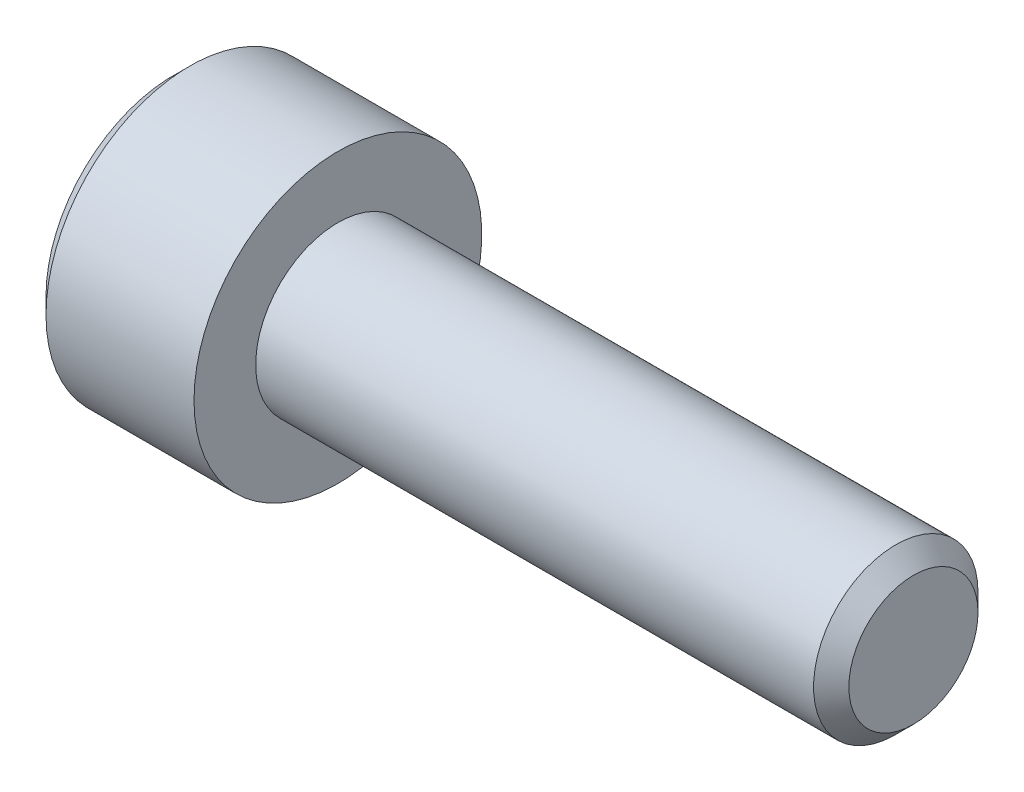
ISO-10303-21;
HEADER;
FILE_DESCRIPTION(('STEP AP214'),'2;1');
FILE_NAME('part.step','',(''),(''),'','','');
FILE_SCHEMA(('AUTOMOTIVE_DESIGN { 1 0 10303 214 1 1 1 1 }'));
ENDSEC;
DATA;
#1=APPLICATION_CONTEXT('core data for automotive mechanical design processes');
#2=APPLICATION_PROTOCOL_DEFINITION('international standard','automotive_design',2000,#1);
#3=PRODUCT_CONTEXT('',#1,'mechanical');
#4=PRODUCT('Part','Part','',(#3));
#5=PRODUCT_RELATED_PRODUCT_CATEGORY('part','',(#4));
#6=PRODUCT_DEFINITION_FORMATION('','',#4);
#7=PRODUCT_DEFINITION_CONTEXT('part definition',#1,'design');
#8=PRODUCT_DEFINITION('design','',#6,#7);
#9=PRODUCT_DEFINITION_SHAPE('','',#8);
#10=(LENGTH_UNIT() NAMED_UNIT(*) SI_UNIT(.MILLI.,.METRE.));
#11=(NAMED_UNIT(*) PLANE_ANGLE_UNIT() SI_UNIT($,.RADIAN.));
#12=(NAMED_UNIT(*) SI_UNIT($,.STERADIAN.) SOLID_ANGLE_UNIT());
#13=UNCERTAINTY_MEASURE_WITH_UNIT(LENGTH_MEASURE(1.E-05),#10,'distance_accuracy_value','');
#14=(GEOMETRIC_REPRESENTATION_CONTEXT(3) GLOBAL_UNCERTAINTY_ASSIGNED_CONTEXT((#13)) GLOBAL_UNIT_ASSIGNED_CONTEXT((#10,
#11,#12)) REPRESENTATION_CONTEXT('',''));
#15=CARTESIAN_POINT('',(0.,0.,0.));
#16=DIRECTION('',(0.,0.,1.));
#17=DIRECTION('',(1.,0.,0.));
#18=AXIS2_PLACEMENT_3D('',#15,#16,#17);
#19=CARTESIAN_POINT('',(-4.,-3.1,3.1));
#20=DIRECTION('',(-1.,0.,0.));
#21=DIRECTION('',(0.,1.,0.));
#22=AXIS2_PLACEMENT_3D('',#19,#20,#21);
#23=PLANE('',#22);
#24=CARTESIAN_POINT('',(-4.,0.,0.));
#25=DIRECTION('',(-1.,0.,0.));
#26=DIRECTION('',(0.,0.,-1.));
#27=AXIS2_PLACEMENT_3D('',#24,#25,#26);
#28=CIRCLE('',#27,3.1);
#29=CARTESIAN_POINT('',(-4.,0.,-3.1));
#30=VERTEX_POINT('',#29);
#31=EDGE_CURVE('E116',#30,#30,#28,.F.);
#32=ORIENTED_EDGE('',*,*,#31,.F.);
#33=EDGE_LOOP('',(#32));
#34=FACE_BOUND('',#33,.T.);
#35=DIRECTION('',(0.,0.500000000000009,-0.866025403784433));
#36=VECTOR('',#35,1.);
#37=CARTESIAN_POINT('',(-4.,-1.7320508075689,0.));
#38=LINE('',#37,#36);
#39=CARTESIAN_POINT('',(-4.,-1.7320508075689,0.));
#40=VERTEX_POINT('',#39);
#41=CARTESIAN_POINT('',(-4.,-0.86602540378444,-1.5));
#42=VERTEX_POINT('',#41);
#43=EDGE_CURVE('E101',#40,#42,#38,.T.);
#44=ORIENTED_EDGE('',*,*,#43,.T.);
#45=DIRECTION('',(0.,1.,0.));
#46=VECTOR('',#45,1.);
#47=CARTESIAN_POINT('',(-4.,-0.86602540378444,-1.5));
#48=LINE('',#47,#46);
#49=CARTESIAN_POINT('',(-4.,0.866025403784441,-1.5));
#50=VERTEX_POINT('',#49);
#51=EDGE_CURVE('E89',#42,#50,#48,.T.);
#52=ORIENTED_EDGE('',*,*,#51,.T.);
#53=DIRECTION('',(0.,0.500000000000009,0.866025403784433));
#54=VECTOR('',#53,1.);
#55=CARTESIAN_POINT('',(-4.,0.866025403784441,-1.5));
#56=LINE('',#55,#54);
#57=CARTESIAN_POINT('',(-4.,1.7320508075689,0.));
#58=VERTEX_POINT('',#57);
#59=EDGE_CURVE('E100',#50,#58,#56,.T.);
#60=ORIENTED_EDGE('',*,*,#59,.T.);
#61=DIRECTION('',(0.,-0.500000000000009,0.866025403784433));
#62=VECTOR('',#61,1.);
#63=CARTESIAN_POINT('',(-4.,1.7320508075689,0.));
#64=LINE('',#63,#62);
#65=CARTESIAN_POINT('',(-4.,0.866025403784441,1.5));
#66=VERTEX_POINT('',#65);
#67=EDGE_CURVE('E126',#58,#66,#64,.T.);
#68=ORIENTED_EDGE('',*,*,#67,.T.);
#69=DIRECTION('',(0.,-1.,0.));
#70=VECTOR('',#69,1.);
#71=CARTESIAN_POINT('',(-4.,0.866025403784441,1.5));
#72=LINE('',#71,#70);
#73=CARTESIAN_POINT('',(-4.,-0.86602540378444,1.5));
#74=VERTEX_POINT('',#73);
#75=EDGE_CURVE('E131',#66,#74,#72,.T.);
#76=ORIENTED_EDGE('',*,*,#75,.T.);
#77=DIRECTION('',(0.,-0.500000000000009,-0.866025403784433));
#78=VECTOR('',#77,1.);
#79=CARTESIAN_POINT('',(-4.,-0.86602540378444,1.5));
#80=LINE('',#79,#78);
#81=EDGE_CURVE('E115',#74,#40,#80,.T.);
#82=ORIENTED_EDGE('',*,*,#81,.T.);
#83=EDGE_LOOP('',(#44,#52,#60,#68,#76,#82));
#84=FACE_BOUND('',#83,.T.);
#85=ADVANCED_FACE('F17',(#34,#84),#23,.T.);
#86=CARTESIAN_POINT('',(0.,-3.5,-3.5));
#87=DIRECTION('',(1.,0.,0.));
#88=DIRECTION('',(0.,1.,0.));
#89=AXIS2_PLACEMENT_3D('',#86,#87,#88);
#90=PLANE('',#89);
#91=CARTESIAN_POINT('',(0.,0.,0.));
#92=DIRECTION('',(1.,0.,0.));
#93=DIRECTION('',(0.,0.,1.));
#94=AXIS2_PLACEMENT_3D('',#91,#92,#93);
#95=CIRCLE('',#94,3.5);
#96=CARTESIAN_POINT('',(0.,0.,3.5));
#97=VERTEX_POINT('',#96);
#98=EDGE_CURVE('E138',#97,#97,#95,.T.);
#99=ORIENTED_EDGE('',*,*,#98,.T.);
#100=EDGE_LOOP('',(#99));
#101=FACE_BOUND('',#100,.T.);
#102=CARTESIAN_POINT('',(0.,0.,0.));
#103=DIRECTION('',(-1.,0.,0.));
#104=DIRECTION('',(0.,0.,-1.));
#105=AXIS2_PLACEMENT_3D('',#102,#103,#104);
#106=CIRCLE('',#105,2.);
#107=CARTESIAN_POINT('',(0.,0.,-2.));
#108=VERTEX_POINT('',#107);
#109=EDGE_CURVE('E143',#108,#108,#106,.F.);
#110=ORIENTED_EDGE('',*,*,#109,.F.);
#111=EDGE_LOOP('',(#110));
#112=FACE_BOUND('',#111,.T.);
#113=ADVANCED_FACE('F265',(#101,#112),#90,.T.);
#114=CARTESIAN_POINT('',(14.,-1.5705,-1.5705));
#115=DIRECTION('',(1.,0.,0.));
#116=DIRECTION('',(0.,1.,0.));
#117=AXIS2_PLACEMENT_3D('',#114,#115,#116);
#118=PLANE('',#117);
#119=CARTESIAN_POINT('',(14.,0.,0.));
#120=DIRECTION('',(1.,0.,0.));
#121=DIRECTION('',(0.,0.,1.));
#122=AXIS2_PLACEMENT_3D('',#119,#120,#121);
#123=CIRCLE('',#122,1.5705);
#124=CARTESIAN_POINT('',(14.,0.,1.5705));
#125=VERTEX_POINT('',#124);
#126=EDGE_CURVE('E146',#125,#125,#123,.T.);
#127=ORIENTED_EDGE('',*,*,#126,.T.);
#128=EDGE_LOOP('',(#127));
#129=FACE_BOUND('',#128,.T.);
#130=ADVANCED_FACE('F271',(#129),#118,.T.);
#131=CARTESIAN_POINT('',(-2.,-0.86602540378444,1.5));
#132=DIRECTION('',(0.,0.,-1.));
#133=DIRECTION('',(-1.,0.,0.));
#134=AXIS2_PLACEMENT_3D('',#131,#132,#133);
#135=PLANE('',#134);
#136=ORIENTED_EDGE('',*,*,#75,.F.);
#137=DIRECTION('',(1.,0.,0.));
#138=VECTOR('',#137,1.);
#139=CARTESIAN_POINT('',(-4.,0.86602540378444,1.5));
#140=LINE('',#139,#138);
#141=CARTESIAN_POINT('',(-2.,0.86602540378444,1.5));
#142=VERTEX_POINT('',#141);
#143=EDGE_CURVE('E149',#142,#66,#140,.F.);
#144=ORIENTED_EDGE('',*,*,#143,.F.);
#145=DIRECTION('',(0.,-1.,0.));
#146=VECTOR('',#145,1.);
#147=CARTESIAN_POINT('',(-2.,0.86602540378444,1.5));
#148=LINE('',#147,#146);
#149=CARTESIAN_POINT('',(-2.,0.,1.5));
#150=VERTEX_POINT('',#149);
#151=EDGE_CURVE('E151',#142,#150,#148,.T.);
#152=ORIENTED_EDGE('',*,*,#151,.T.);
#153=DIRECTION('',(0.,-1.,0.));
#154=VECTOR('',#153,1.);
#155=CARTESIAN_POINT('',(-2.,0.,1.5));
#156=LINE('',#155,#154);
#157=CARTESIAN_POINT('',(-2.,-0.86602540378444,1.5));
#158=VERTEX_POINT('',#157);
#159=EDGE_CURVE('E156',#150,#158,#156,.T.);
#160=ORIENTED_EDGE('',*,*,#159,.T.);
#161=DIRECTION('',(-1.,0.,0.));
#162=VECTOR('',#161,1.);
#163=CARTESIAN_POINT('',(-2.,-0.86602540378444,1.5));
#164=LINE('',#163,#162);
#165=EDGE_CURVE('E161',#158,#74,#164,.T.);
#166=ORIENTED_EDGE('',*,*,#165,.T.);
#167=EDGE_LOOP('',(#136,#144,#152,#160,#166));
#168=FACE_BOUND('',#167,.T.);
#169=ADVANCED_FACE('F277',(#168),#135,.T.);
#170=CARTESIAN_POINT('',(-4.,-1.7320508075689,0.));
#171=DIRECTION('',(0.,0.866025403784434,-0.500000000000009));
#172=DIRECTION('',(0.,0.500000000000009,0.866025403784434));
#173=AXIS2_PLACEMENT_3D('',#170,#171,#172);
#174=PLANE('',#173);
#175=ORIENTED_EDGE('',*,*,#81,.F.);
#176=ORIENTED_EDGE('',*,*,#165,.F.);
#177=DIRECTION('',(0.,-0.500000000000009,-0.866025403784434));
#178=VECTOR('',#177,1.);
#179=CARTESIAN_POINT('',(-2.,-0.86602540378444,1.5));
#180=LINE('',#179,#178);
#181=CARTESIAN_POINT('',(-2.,-1.29903810567666,0.750000000000018));
#182=VERTEX_POINT('',#181);
#183=EDGE_CURVE('E166',#158,#182,#180,.T.);
#184=ORIENTED_EDGE('',*,*,#183,.T.);
#185=DIRECTION('',(0.,-0.500000000000009,-0.866025403784434));
#186=VECTOR('',#185,1.);
#187=CARTESIAN_POINT('',(-2.,-1.29903810567666,0.750000000000018));
#188=LINE('',#187,#186);
#189=CARTESIAN_POINT('',(-2.,-1.7320508075689,0.));
#190=VERTEX_POINT('',#189);
#191=EDGE_CURVE('E171',#182,#190,#188,.T.);
#192=ORIENTED_EDGE('',*,*,#191,.T.);
#193=DIRECTION('',(-1.,0.,0.));
#194=VECTOR('',#193,1.);
#195=CARTESIAN_POINT('',(-2.,-1.7320508075689,0.));
#196=LINE('',#195,#194);
#197=EDGE_CURVE('E176',#190,#40,#196,.T.);
#198=ORIENTED_EDGE('',*,*,#197,.T.);
#199=EDGE_LOOP('',(#175,#176,#184,#192,#198));
#200=FACE_BOUND('',#199,.T.);
#201=ADVANCED_FACE('F281',(#200),#174,.T.);
#202=CARTESIAN_POINT('',(-4.,-0.866025403784441,-1.5));
#203=DIRECTION('',(0.,0.866025403784434,0.500000000000009));
#204=DIRECTION('',(0.,-0.500000000000009,0.866025403784434));
#205=AXIS2_PLACEMENT_3D('',#202,#203,#204);
#206=PLANE('',#205);
#207=ORIENTED_EDGE('',*,*,#43,.F.);
#208=ORIENTED_EDGE('',*,*,#197,.F.);
#209=DIRECTION('',(0.,0.500000000000009,-0.866025403784434));
#210=VECTOR('',#209,1.);
#211=CARTESIAN_POINT('',(-2.,-1.7320508075689,0.));
#212=LINE('',#211,#210);
#213=CARTESIAN_POINT('',(-2.,-1.29903810567666,-0.750000000000019));
#214=VERTEX_POINT('',#213);
#215=EDGE_CURVE('E180',#190,#214,#212,.T.);
#216=ORIENTED_EDGE('',*,*,#215,.T.);
#217=DIRECTION('',(0.,0.500000000000009,-0.866025403784433));
#218=VECTOR('',#217,1.);
#219=CARTESIAN_POINT('',(-2.,-1.29903810567666,-0.750000000000019));
#220=LINE('',#219,#218);
#221=CARTESIAN_POINT('',(-2.,-0.866025403784441,-1.5));
#222=VERTEX_POINT('',#221);
#223=EDGE_CURVE('E110',#214,#222,#220,.T.);
#224=ORIENTED_EDGE('',*,*,#223,.T.);
#225=DIRECTION('',(-1.,0.,0.));
#226=VECTOR('',#225,1.);
#227=CARTESIAN_POINT('',(-2.,-0.866025403784441,-1.5));
#228=LINE('',#227,#226);
#229=EDGE_CURVE('E93',#222,#42,#228,.T.);
#230=ORIENTED_EDGE('',*,*,#229,.T.);
#231=EDGE_LOOP('',(#207,#208,#216,#224,#230));
#232=FACE_BOUND('',#231,.T.);
#233=ADVANCED_FACE('F105',(#232),#206,.T.);
#234=CARTESIAN_POINT('',(-4.,-0.86602540378444,-1.5));
#235=DIRECTION('',(0.,0.,1.));
#236=DIRECTION('',(1.,0.,0.));
#237=AXIS2_PLACEMENT_3D('',#234,#235,#236);
#238=PLANE('',#237);
#239=ORIENTED_EDGE('',*,*,#51,.F.);
#240=ORIENTED_EDGE('',*,*,#229,.F.);
#241=DIRECTION('',(0.,1.,0.));
#242=VECTOR('',#241,1.);
#243=CARTESIAN_POINT('',(-2.,-0.86602540378444,-1.5));
#244=LINE('',#243,#242);
#245=CARTESIAN_POINT('',(-2.,0.,-1.5));
#246=VERTEX_POINT('',#245);
#247=EDGE_CURVE('E111',#222,#246,#244,.T.);
#248=ORIENTED_EDGE('',*,*,#247,.T.);
#249=DIRECTION('',(0.,1.,0.));
#250=VECTOR('',#249,1.);
#251=CARTESIAN_POINT('',(-2.,0.,-1.5));
#252=LINE('',#251,#250);
#253=CARTESIAN_POINT('',(-2.,0.86602540378444,-1.5));
#254=VERTEX_POINT('',#253);
#255=EDGE_CURVE('E192',#246,#254,#252,.T.);
#256=ORIENTED_EDGE('',*,*,#255,.T.);
#257=DIRECTION('',(-1.,0.,0.));
#258=VECTOR('',#257,1.);
#259=CARTESIAN_POINT('',(-2.,0.86602540378444,-1.5));
#260=LINE('',#259,#258);
#261=EDGE_CURVE('E96',#254,#50,#260,.T.);
#262=ORIENTED_EDGE('',*,*,#261,.T.);
#263=EDGE_LOOP('',(#239,#240,#248,#256,#262));
#264=FACE_BOUND('',#263,.T.);
#265=ADVANCED_FACE('F91',(#264),#238,.T.);
#266=CARTESIAN_POINT('',(-4.,1.7320508075689,0.));
#267=DIRECTION('',(0.,-0.866025403784434,0.500000000000009));
#268=DIRECTION('',(0.,-0.500000000000009,-0.866025403784434));
#269=AXIS2_PLACEMENT_3D('',#266,#267,#268);
#270=PLANE('',#269);
#271=ORIENTED_EDGE('',*,*,#59,.F.);
#272=ORIENTED_EDGE('',*,*,#261,.F.);
#273=DIRECTION('',(0.,0.500000000000009,0.866025403784434));
#274=VECTOR('',#273,1.);
#275=CARTESIAN_POINT('',(-2.,0.86602540378444,-1.5));
#276=LINE('',#275,#274);
#277=CARTESIAN_POINT('',(-2.,1.29903810567666,-0.750000000000018));
#278=VERTEX_POINT('',#277);
#279=EDGE_CURVE('E199',#254,#278,#276,.T.);
#280=ORIENTED_EDGE('',*,*,#279,.T.);
#281=DIRECTION('',(0.,0.500000000000009,0.866025403784434));
#282=VECTOR('',#281,1.);
#283=CARTESIAN_POINT('',(-2.,1.29903810567666,-0.750000000000018));
#284=LINE('',#283,#282);
#285=CARTESIAN_POINT('',(-2.,1.7320508075689,0.));
#286=VERTEX_POINT('',#285);
#287=EDGE_CURVE('E204',#278,#286,#284,.T.);
#288=ORIENTED_EDGE('',*,*,#287,.T.);
#289=DIRECTION('',(-1.,0.,0.));
#290=VECTOR('',#289,1.);
#291=CARTESIAN_POINT('',(-2.,1.7320508075689,0.));
#292=LINE('',#291,#290);
#293=EDGE_CURVE('E209',#286,#58,#292,.T.);
#294=ORIENTED_EDGE('',*,*,#293,.T.);
#295=EDGE_LOOP('',(#271,#272,#280,#288,#294));
#296=FACE_BOUND('',#295,.T.);
#297=ADVANCED_FACE('F290',(#296),#270,.T.);
#298=CARTESIAN_POINT('',(-4.,0.866025403784441,1.5));
#299=DIRECTION('',(0.,-0.866025403784434,-0.500000000000009));
#300=DIRECTION('',(0.,0.500000000000009,-0.866025403784434));
#301=AXIS2_PLACEMENT_3D('',#298,#299,#300);
#302=PLANE('',#301);
#303=ORIENTED_EDGE('',*,*,#67,.F.);
#304=ORIENTED_EDGE('',*,*,#293,.F.);
#305=DIRECTION('',(0.,-0.500000000000009,0.866025403784434));
#306=VECTOR('',#305,1.);
#307=CARTESIAN_POINT('',(-2.,1.7320508075689,0.));
#308=LINE('',#307,#306);
#309=CARTESIAN_POINT('',(-2.,1.29903810567666,0.750000000000019));
#310=VERTEX_POINT('',#309);
#311=EDGE_CURVE('E214',#286,#310,#308,.T.);
#312=ORIENTED_EDGE('',*,*,#311,.T.);
#313=DIRECTION('',(0.,-0.500000000000009,0.866025403784434));
#314=VECTOR('',#313,1.);
#315=CARTESIAN_POINT('',(-2.,1.29903810567666,0.750000000000019));
#316=LINE('',#315,#314);
#317=EDGE_CURVE('E219',#310,#142,#316,.T.);
#318=ORIENTED_EDGE('',*,*,#317,.T.);
#319=ORIENTED_EDGE('',*,*,#143,.T.);
#320=EDGE_LOOP('',(#303,#304,#312,#318,#319));
#321=FACE_BOUND('',#320,.T.);
#322=ADVANCED_FACE('F293',(#321),#302,.T.);
#323=CARTESIAN_POINT('',(-2.,0.,-0.750000000000017));
#324=DIRECTION('',(-1.,0.,0.));
#325=DIRECTION('',(0.,1.,0.));
#326=AXIS2_PLACEMENT_3D('',#323,#324,#325);
#327=PLANE('',#326);
#328=CARTESIAN_POINT('',(-2.,0.,0.));
#329=DIRECTION('',(1.,0.,0.));
#330=DIRECTION('',(0.,0.,-1.));
#331=AXIS2_PLACEMENT_3D('',#328,#329,#330);
#332=CIRCLE('',#331,1.5);
#333=EDGE_CURVE('E224',#246,#278,#332,.T.);
#334=ORIENTED_EDGE('',*,*,#333,.T.);
#335=ORIENTED_EDGE('',*,*,#279,.F.);
#336=ORIENTED_EDGE('',*,*,#255,.F.);
#337=EDGE_LOOP('',(#334,#335,#336));
#338=FACE_BOUND('',#337,.T.);
#339=ADVANCED_FACE('F297',(#338),#327,.T.);
#340=CARTESIAN_POINT('',(-2.,1.29903810567665,0.750000000000019));
#341=DIRECTION('',(-1.,0.,0.));
#342=DIRECTION('',(0.,1.,0.));
#343=AXIS2_PLACEMENT_3D('',#340,#341,#342);
#344=PLANE('',#343);
#345=ORIENTED_EDGE('',*,*,#287,.F.);
#346=CARTESIAN_POINT('',(-2.,0.,0.));
#347=DIRECTION('',(1.,0.,0.));
#348=DIRECTION('',(0.,0.866025403784434,-0.500000000000009));
#349=AXIS2_PLACEMENT_3D('',#346,#347,#348);
#350=CIRCLE('',#349,1.5);
#351=EDGE_CURVE('E229',#278,#310,#350,.T.);
#352=ORIENTED_EDGE('',*,*,#351,.T.);
#353=ORIENTED_EDGE('',*,*,#311,.F.);
#354=EDGE_LOOP('',(#345,#352,#353));
#355=FACE_BOUND('',#354,.T.);
#356=ADVANCED_FACE('F301',(#355),#344,.T.);
#357=CARTESIAN_POINT('',(-2.,0.,1.5));
#358=DIRECTION('',(-1.,0.,0.));
#359=DIRECTION('',(0.,1.,0.));
#360=AXIS2_PLACEMENT_3D('',#357,#358,#359);
#361=PLANE('',#360);
#362=CARTESIAN_POINT('',(-2.,0.,0.));
#363=DIRECTION('',(1.,0.,0.));
#364=DIRECTION('',(0.,0.866025403784434,0.500000000000009));
#365=AXIS2_PLACEMENT_3D('',#362,#363,#364);
#366=CIRCLE('',#365,1.5);
#367=EDGE_CURVE('E35',#310,#150,#366,.T.);
#368=ORIENTED_EDGE('',*,*,#367,.T.);
#369=ORIENTED_EDGE('',*,*,#151,.F.);
#370=ORIENTED_EDGE('',*,*,#317,.F.);
#371=EDGE_LOOP('',(#368,#369,#370));
#372=FACE_BOUND('',#371,.T.);
#373=ADVANCED_FACE('F305',(#372),#361,.T.);
#374=CARTESIAN_POINT('',(-2.,-1.29903810567666,1.5));
#375=DIRECTION('',(-1.,0.,0.));
#376=DIRECTION('',(0.,1.,0.));
#377=AXIS2_PLACEMENT_3D('',#374,#375,#376);
#378=PLANE('',#377);
#379=CARTESIAN_POINT('',(-2.,0.,0.));
#380=DIRECTION('',(1.,0.,0.));
#381=DIRECTION('',(0.,0.,1.));
#382=AXIS2_PLACEMENT_3D('',#379,#380,#381);
#383=CIRCLE('',#382,1.5);
#384=EDGE_CURVE('E236',#150,#182,#383,.T.);
#385=ORIENTED_EDGE('',*,*,#384,.T.);
#386=ORIENTED_EDGE('',*,*,#183,.F.);
#387=ORIENTED_EDGE('',*,*,#159,.F.);
#388=EDGE_LOOP('',(#385,#386,#387));
#389=FACE_BOUND('',#388,.T.);
#390=ADVANCED_FACE('F309',(#389),#378,.T.);
#391=CARTESIAN_POINT('',(-2.,-1.7320508075689,0.750000000000018));
#392=DIRECTION('',(-1.,0.,0.));
#393=DIRECTION('',(0.,1.,0.));
#394=AXIS2_PLACEMENT_3D('',#391,#392,#393);
#395=PLANE('',#394);
#396=CARTESIAN_POINT('',(-2.,0.,0.));
#397=DIRECTION('',(1.,0.,0.));
#398=DIRECTION('',(0.,-0.866025403784434,0.500000000000009));
#399=AXIS2_PLACEMENT_3D('',#396,#397,#398);
#400=CIRCLE('',#399,1.5);
#401=EDGE_CURVE('E241',#182,#214,#400,.T.);
#402=ORIENTED_EDGE('',*,*,#401,.T.);
#403=ORIENTED_EDGE('',*,*,#215,.F.);
#404=ORIENTED_EDGE('',*,*,#191,.F.);
#405=EDGE_LOOP('',(#402,#403,#404));
#406=FACE_BOUND('',#405,.T.);
#407=ADVANCED_FACE('F313',(#406),#395,.T.);
#408=CARTESIAN_POINT('',(-2.,-1.29903810567666,-0.750000000000019));
#409=DIRECTION('',(-1.,0.,0.));
#410=DIRECTION('',(0.,1.,0.));
#411=AXIS2_PLACEMENT_3D('',#408,#409,#410);
#412=PLANE('',#411);
#413=CARTESIAN_POINT('',(-2.,0.,0.));
#414=DIRECTION('',(1.,0.,0.));
#415=DIRECTION('',(0.,-0.866025403784433,-0.500000000000009));
#416=AXIS2_PLACEMENT_3D('',#413,#414,#415);
#417=CIRCLE('',#416,1.5);
#418=EDGE_CURVE('E246',#214,#246,#417,.T.);
#419=ORIENTED_EDGE('',*,*,#418,.T.);
#420=ORIENTED_EDGE('',*,*,#247,.F.);
#421=ORIENTED_EDGE('',*,*,#223,.F.);
#422=EDGE_LOOP('',(#419,#420,#421));
#423=FACE_BOUND('',#422,.T.);
#424=ADVANCED_FACE('F260',(#423),#412,.T.);
#425=CARTESIAN_POINT('',(-3.6,0.,0.));
#426=DIRECTION('',(1.,0.,0.));
#427=DIRECTION('',(0.,0.,1.));
#428=AXIS2_PLACEMENT_3D('',#425,#426,#427);
#429=CONICAL_SURFACE('',#428,3.5,0.785398163397446);
#430=CARTESIAN_POINT('',(-3.6,0.,0.));
#431=DIRECTION('',(-1.,0.,0.));
#432=DIRECTION('',(0.,0.,-1.));
#433=AXIS2_PLACEMENT_3D('',#430,#431,#432);
#434=CIRCLE('',#433,3.5);
#435=CARTESIAN_POINT('',(-3.6,0.,-3.5));
#436=VERTEX_POINT('',#435);
#437=EDGE_CURVE('E25',#436,#436,#434,.F.);
#438=ORIENTED_EDGE('',*,*,#437,.F.);
#439=EDGE_LOOP('',(#438));
#440=FACE_BOUND('',#439,.T.);
#441=ORIENTED_EDGE('',*,*,#31,.T.);
#442=EDGE_LOOP('',(#441));
#443=FACE_BOUND('',#442,.T.);
#444=ADVANCED_FACE('F257',(#440,#443),#429,.T.);
#445=CARTESIAN_POINT('',(14.,0.,0.));
#446=DIRECTION('',(1.,0.,0.));
#447=DIRECTION('',(0.,0.,1.));
#448=AXIS2_PLACEMENT_3D('',#445,#446,#447);
#449=CYLINDRICAL_SURFACE('',#448,3.5);
#450=ORIENTED_EDGE('',*,*,#98,.F.);
#451=EDGE_LOOP('',(#450));
#452=FACE_BOUND('',#451,.T.);
#453=ORIENTED_EDGE('',*,*,#437,.T.);
#454=EDGE_LOOP('',(#453));
#455=FACE_BOUND('',#454,.T.);
#456=ADVANCED_FACE('F255',(#452,#455),#449,.T.);
#457=CARTESIAN_POINT('',(14.,0.,0.));
#458=DIRECTION('',(1.,0.,0.));
#459=DIRECTION('',(0.,1.42053899876766E-07,0.99999999999999));
#460=AXIS2_PLACEMENT_3D('',#457,#458,#459);
#461=CYLINDRICAL_SURFACE('',#460,2.);
#462=CARTESIAN_POINT('',(13.5705,0.,0.));
#463=DIRECTION('',(-1.,0.,0.));
#464=DIRECTION('',(0.,0.,-1.));
#465=AXIS2_PLACEMENT_3D('',#462,#463,#464);
#466=CIRCLE('',#465,2.);
#467=CARTESIAN_POINT('',(13.5705,0.,-2.));
#468=VERTEX_POINT('',#467);
#469=EDGE_CURVE('E11',#468,#468,#466,.F.);
#470=ORIENTED_EDGE('',*,*,#469,.F.);
#471=EDGE_LOOP('',(#470));
#472=FACE_BOUND('',#471,.T.);
#473=ORIENTED_EDGE('',*,*,#109,.T.);
#474=EDGE_LOOP('',(#473));
#475=FACE_BOUND('',#474,.T.);
#476=ADVANCED_FACE('F323',(#472,#475),#461,.T.);
#477=CARTESIAN_POINT('',(13.5705,0.,0.));
#478=DIRECTION('',(-1.,0.,0.));
#479=DIRECTION('',(0.,0.,-1.));
#480=AXIS2_PLACEMENT_3D('',#477,#478,#479);
#481=CONICAL_SURFACE('',#480,2.,0.785398163397448);
#482=ORIENTED_EDGE('',*,*,#126,.F.);
#483=EDGE_LOOP('',(#482));
#484=FACE_BOUND('',#483,.T.);
#485=ORIENTED_EDGE('',*,*,#469,.T.);
#486=EDGE_LOOP('',(#485));
#487=FACE_BOUND('',#486,.T.);
#488=ADVANCED_FACE('F326',(#484,#487),#481,.T.);
#489=CARTESIAN_POINT('',(-2.,0.,0.));
#490=DIRECTION('',(-1.,0.,0.));
#491=DIRECTION('',(0.,0.,-1.));
#492=AXIS2_PLACEMENT_3D('',#489,#490,#491);
#493=CONICAL_SURFACE('',#492,1.50000000000001,1.30899693899574);
#494=ORIENTED_EDGE('',*,*,#418,.F.);
#495=ORIENTED_EDGE('',*,*,#401,.F.);
#496=ORIENTED_EDGE('',*,*,#384,.F.);
#497=ORIENTED_EDGE('',*,*,#367,.F.);
#498=ORIENTED_EDGE('',*,*,#351,.F.);
#499=ORIENTED_EDGE('',*,*,#333,.F.);
#500=EDGE_LOOP('',(#494,#495,#496,#497,#498,#499));
#501=FACE_BOUND('',#500,.T.);
#502=CARTESIAN_POINT('',(-1.5980762113533,0.,0.));
#503=VERTEX_POINT('',#502);
#504=VERTEX_LOOP('',#503);
#505=FACE_BOUND('',#504,.T.);
#506=ADVANCED_FACE('F19',(#501,#505),#493,.F.);
#507=CLOSED_SHELL('',(#85,#113,#130,#169,#201,#233,#265,#297,#322,#339,#356,#373,#390,#407,#424,
#444,#456,#476,#488,#506));
#508=MANIFOLD_SOLID_BREP('B1',#507);
#509=ADVANCED_BREP_SHAPE_REPRESENTATION('',(#18,#508),#14);
#510=SHAPE_DEFINITION_REPRESENTATION(#9,#509);
ENDSEC;
END-ISO-10303-21;
